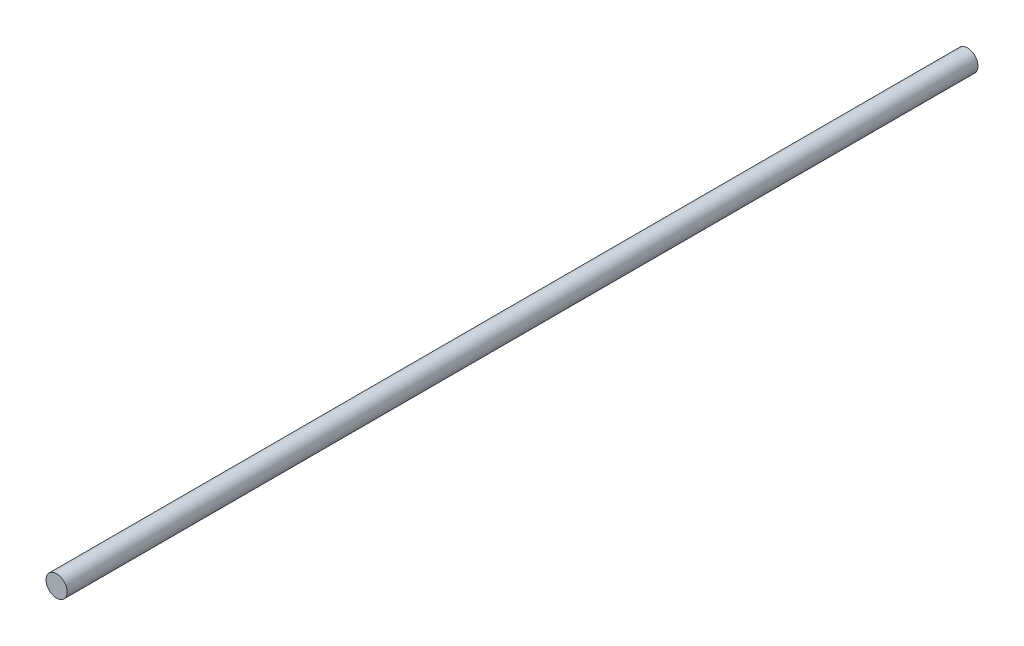
ISO-10303-21;
HEADER;
FILE_DESCRIPTION(('STEP AP214'),'2;1');
FILE_NAME('part.step','',(''),(''),'','','');
FILE_SCHEMA(('AUTOMOTIVE_DESIGN { 1 0 10303 214 1 1 1 1 }'));
ENDSEC;
DATA;
#1=APPLICATION_CONTEXT('core data for automotive mechanical design processes');
#2=APPLICATION_PROTOCOL_DEFINITION('international standard','automotive_design',2000,#1);
#3=PRODUCT_CONTEXT('',#1,'mechanical');
#4=PRODUCT('Part','Part','',(#3));
#5=PRODUCT_RELATED_PRODUCT_CATEGORY('part','',(#4));
#6=PRODUCT_DEFINITION_FORMATION('','',#4);
#7=PRODUCT_DEFINITION_CONTEXT('part definition',#1,'design');
#8=PRODUCT_DEFINITION('design','',#6,#7);
#9=PRODUCT_DEFINITION_SHAPE('','',#8);
#10=(LENGTH_UNIT() NAMED_UNIT(*) SI_UNIT(.MILLI.,.METRE.));
#11=(NAMED_UNIT(*) PLANE_ANGLE_UNIT() SI_UNIT($,.RADIAN.));
#12=(NAMED_UNIT(*) SI_UNIT($,.STERADIAN.) SOLID_ANGLE_UNIT());
#13=UNCERTAINTY_MEASURE_WITH_UNIT(LENGTH_MEASURE(1.E-05),#10,'distance_accuracy_value','');
#14=(GEOMETRIC_REPRESENTATION_CONTEXT(3) GLOBAL_UNCERTAINTY_ASSIGNED_CONTEXT((#13)) GLOBAL_UNIT_ASSIGNED_CONTEXT((#10,
#11,#12)) REPRESENTATION_CONTEXT('',''));
#15=CARTESIAN_POINT('',(0.,0.,0.));
#16=DIRECTION('',(0.,0.,1.));
#17=DIRECTION('',(1.,0.,0.));
#18=AXIS2_PLACEMENT_3D('',#15,#16,#17);
#19=CARTESIAN_POINT('',(0.,0.,215.));
#20=DIRECTION('',(0.,0.,-1.));
#21=DIRECTION('',(-1.,0.,0.));
#22=AXIS2_PLACEMENT_3D('',#19,#20,#21);
#23=CYLINDRICAL_SURFACE('',#22,2.5);
#24=CARTESIAN_POINT('',(0.,0.,215.));
#25=DIRECTION('',(0.,0.,1.));
#26=DIRECTION('',(1.,0.,0.));
#27=AXIS2_PLACEMENT_3D('',#24,#25,#26);
#28=CIRCLE('',#27,2.5);
#29=CARTESIAN_POINT('',(2.5,0.,215.));
#30=VERTEX_POINT('',#29);
#31=EDGE_CURVE('E10',#30,#30,#28,.T.);
#32=ORIENTED_EDGE('',*,*,#31,.F.);
#33=EDGE_LOOP('',(#32));
#34=FACE_BOUND('',#33,.T.);
#35=CARTESIAN_POINT('',(0.,0.,0.));
#36=DIRECTION('',(0.,0.,1.));
#37=DIRECTION('',(1.,0.,0.));
#38=AXIS2_PLACEMENT_3D('',#35,#36,#37);
#39=CIRCLE('',#38,2.5);
#40=CARTESIAN_POINT('',(2.5,0.,0.));
#41=VERTEX_POINT('',#40);
#42=EDGE_CURVE('E40',#41,#41,#39,.T.);
#43=ORIENTED_EDGE('',*,*,#42,.T.);
#44=EDGE_LOOP('',(#43));
#45=FACE_BOUND('',#44,.T.);
#46=ADVANCED_FACE('F37',(#34,#45),#23,.T.);
#47=CARTESIAN_POINT('',(0.,0.,215.));
#48=DIRECTION('',(0.,0.,1.));
#49=DIRECTION('',(1.,0.,0.));
#50=AXIS2_PLACEMENT_3D('',#47,#48,#49);
#51=PLANE('',#50);
#52=ORIENTED_EDGE('',*,*,#31,.T.);
#53=EDGE_LOOP('',(#52));
#54=FACE_BOUND('',#53,.T.);
#55=ADVANCED_FACE('F52',(#54),#51,.T.);
#56=CARTESIAN_POINT('',(0.,0.,0.));
#57=DIRECTION('',(0.,0.,1.));
#58=DIRECTION('',(1.,0.,0.));
#59=AXIS2_PLACEMENT_3D('',#56,#57,#58);
#60=PLANE('',#59);
#61=ORIENTED_EDGE('',*,*,#42,.F.);
#62=EDGE_LOOP('',(#61));
#63=FACE_BOUND('',#62,.T.);
#64=ADVANCED_FACE('F50',(#63),#60,.F.);
#65=CLOSED_SHELL('',(#46,#55,#64));
#66=MANIFOLD_SOLID_BREP('B2',#65);
#67=ADVANCED_BREP_SHAPE_REPRESENTATION('',(#18,#66),#14);
#68=SHAPE_DEFINITION_REPRESENTATION(#9,#67);
ENDSEC;
END-ISO-10303-21;
